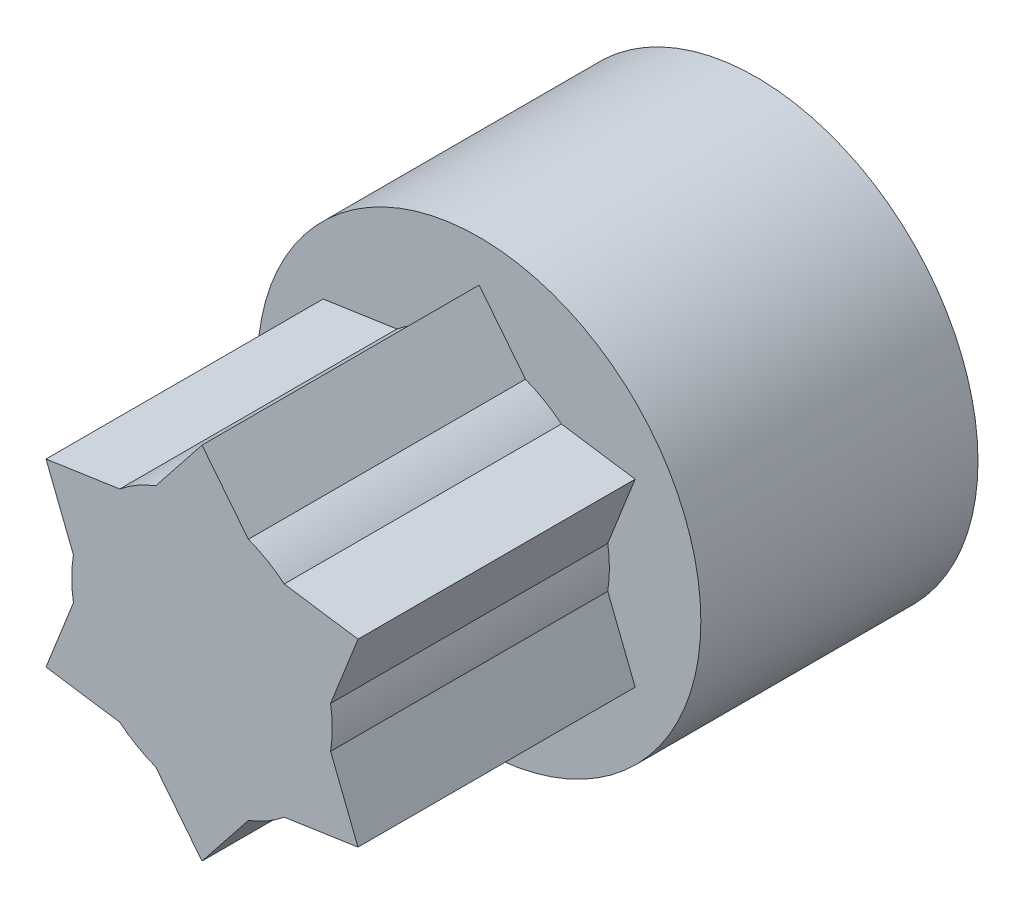
ISO-10303-21;
HEADER;
FILE_DESCRIPTION(('STEP AP214'),'2;1');
FILE_NAME('part.step','',(''),(''),'','','');
FILE_SCHEMA(('AUTOMOTIVE_DESIGN { 1 0 10303 214 1 1 1 1 }'));
ENDSEC;
DATA;
#1=APPLICATION_CONTEXT('core data for automotive mechanical design processes');
#2=APPLICATION_PROTOCOL_DEFINITION('international standard','automotive_design',2000,#1);
#3=PRODUCT_CONTEXT('',#1,'mechanical');
#4=PRODUCT('Part','Part','',(#3));
#5=PRODUCT_RELATED_PRODUCT_CATEGORY('part','',(#4));
#6=PRODUCT_DEFINITION_FORMATION('','',#4);
#7=PRODUCT_DEFINITION_CONTEXT('part definition',#1,'design');
#8=PRODUCT_DEFINITION('design','',#6,#7);
#9=PRODUCT_DEFINITION_SHAPE('','',#8);
#10=(LENGTH_UNIT() NAMED_UNIT(*) SI_UNIT(.MILLI.,.METRE.));
#11=(NAMED_UNIT(*) PLANE_ANGLE_UNIT() SI_UNIT($,.RADIAN.));
#12=(NAMED_UNIT(*) SI_UNIT($,.STERADIAN.) SOLID_ANGLE_UNIT());
#13=UNCERTAINTY_MEASURE_WITH_UNIT(LENGTH_MEASURE(1.E-05),#10,'distance_accuracy_value','');
#14=(GEOMETRIC_REPRESENTATION_CONTEXT(3) GLOBAL_UNCERTAINTY_ASSIGNED_CONTEXT((#13)) GLOBAL_UNIT_ASSIGNED_CONTEXT((#10,
#11,#12)) REPRESENTATION_CONTEXT('',''));
#15=CARTESIAN_POINT('',(0.,0.,0.));
#16=DIRECTION('',(0.,0.,1.));
#17=DIRECTION('',(1.,0.,0.));
#18=AXIS2_PLACEMENT_3D('',#15,#16,#17);
#19=CARTESIAN_POINT('',(0.,0.,36.602998));
#20=DIRECTION('',(0.,0.,-1.));
#21=DIRECTION('',(-1.,0.,0.));
#22=AXIS2_PLACEMENT_3D('',#19,#20,#21);
#23=CYLINDRICAL_SURFACE('',#22,2.35);
#24=CARTESIAN_POINT('',(0.,0.,31.602998));
#25=DIRECTION('',(0.,0.,1.));
#26=DIRECTION('',(1.,0.,0.));
#27=AXIS2_PLACEMENT_3D('',#24,#25,#26);
#28=CIRCLE('',#27,2.35);
#29=CARTESIAN_POINT('',(2.32002328579731,-0.374154985745534,31.602998));
#30=VERTEX_POINT('',#29);
#31=CARTESIAN_POINT('',(2.32002328579732,0.374154985745518,31.602998));
#32=VERTEX_POINT('',#31);
#33=EDGE_CURVE('E162',#30,#32,#28,.T.);
#34=ORIENTED_EDGE('',*,*,#33,.T.);
#35=DIRECTION('',(0.,0.,-1.));
#36=VECTOR('',#35,1.);
#37=CARTESIAN_POINT('',(2.32002328579732,0.374154985745518,36.602998));
#38=LINE('',#37,#36);
#39=CARTESIAN_POINT('',(2.32002328579732,0.374154985745518,36.602998));
#40=VERTEX_POINT('',#39);
#41=EDGE_CURVE('E11',#40,#32,#38,.T.);
#42=ORIENTED_EDGE('',*,*,#41,.F.);
#43=CARTESIAN_POINT('',(0.,0.,36.602998));
#44=DIRECTION('',(0.,0.,1.));
#45=DIRECTION('',(1.,0.,0.));
#46=AXIS2_PLACEMENT_3D('',#43,#44,#45);
#47=CIRCLE('',#46,2.35);
#48=CARTESIAN_POINT('',(2.32002328579731,-0.374154985745534,36.602998));
#49=VERTEX_POINT('',#48);
#50=EDGE_CURVE('E234',#49,#40,#47,.T.);
#51=ORIENTED_EDGE('',*,*,#50,.F.);
#52=DIRECTION('',(0.,0.,-1.));
#53=VECTOR('',#52,1.);
#54=CARTESIAN_POINT('',(2.32002328579731,-0.374154985745534,36.602998));
#55=LINE('',#54,#53);
#56=EDGE_CURVE('E53',#49,#30,#55,.T.);
#57=ORIENTED_EDGE('',*,*,#56,.T.);
#58=EDGE_LOOP('',(#34,#42,#51,#57));
#59=FACE_BOUND('',#58,.T.);
#60=ADVANCED_FACE('F37',(#59),#23,.T.);
#61=CARTESIAN_POINT('',(1.87844159797998,-0.742698501462353,36.602998));
#62=DIRECTION('',(-0.929950766952791,0.367684064169113,0.));
#63=DIRECTION('',(-0.367684064169113,-0.929950766952791,0.));
#64=AXIS2_PLACEMENT_3D('',#61,#62,#63);
#65=PLANE('',#64);
#66=DIRECTION('',(0.367684064169113,0.929950766952791,0.));
#67=VECTOR('',#66,1.);
#68=CARTESIAN_POINT('',(1.87844159797998,-0.742698501462353,31.602998));
#69=LINE('',#68,#67);
#70=CARTESIAN_POINT('',(2.81458256229943,1.62499999999999,31.602998));
#71=VERTEX_POINT('',#70);
#72=EDGE_CURVE('E159',#32,#71,#69,.T.);
#73=ORIENTED_EDGE('',*,*,#72,.T.);
#74=DIRECTION('',(0.,0.,-1.));
#75=VECTOR('',#74,1.);
#76=CARTESIAN_POINT('',(2.81458256229943,1.62499999999999,36.602998));
#77=LINE('',#76,#75);
#78=CARTESIAN_POINT('',(2.81458256229943,1.62499999999999,36.602998));
#79=VERTEX_POINT('',#78);
#80=EDGE_CURVE('E46',#79,#71,#77,.T.);
#81=ORIENTED_EDGE('',*,*,#80,.F.);
#82=DIRECTION('',(0.367684064169113,0.929950766952791,0.));
#83=VECTOR('',#82,1.);
#84=CARTESIAN_POINT('',(1.87844159797998,-0.742698501462353,36.602998));
#85=LINE('',#84,#83);
#86=EDGE_CURVE('E170',#40,#79,#85,.T.);
#87=ORIENTED_EDGE('',*,*,#86,.F.);
#88=ORIENTED_EDGE('',*,*,#41,.T.);
#89=EDGE_LOOP('',(#73,#81,#87,#88));
#90=FACE_BOUND('',#89,.T.);
#91=ADVANCED_FACE('F39',(#90),#65,.F.);
#92=CARTESIAN_POINT('',(0.296025029370969,1.99812739410728,36.602998));
#93=DIRECTION('',(0.14655164333924,0.989203020534495,0.));
#94=DIRECTION('',(-0.989203020534495,0.14655164333924,0.));
#95=AXIS2_PLACEMENT_3D('',#92,#93,#94);
#96=PLANE('',#95);
#97=DIRECTION('',(0.989203020534495,-0.14655164333924,0.));
#98=VECTOR('',#97,1.);
#99=CARTESIAN_POINT('',(0.296025029370969,1.99812739410728,31.602998));
#100=LINE('',#99,#98);
#101=CARTESIAN_POINT('',(1.48403936550689,1.82212160999915,31.602998));
#102=VERTEX_POINT('',#101);
#103=EDGE_CURVE('E164',#102,#71,#100,.T.);
#104=ORIENTED_EDGE('',*,*,#103,.F.);
#105=DIRECTION('',(0.,0.,-1.));
#106=VECTOR('',#105,1.);
#107=CARTESIAN_POINT('',(1.48403936550689,1.82212160999915,36.602998));
#108=LINE('',#107,#106);
#109=CARTESIAN_POINT('',(1.48403936550689,1.82212160999915,36.602998));
#110=VERTEX_POINT('',#109);
#111=EDGE_CURVE('E271',#110,#102,#108,.T.);
#112=ORIENTED_EDGE('',*,*,#111,.F.);
#113=DIRECTION('',(0.989203020534495,-0.14655164333924,0.));
#114=VECTOR('',#113,1.);
#115=CARTESIAN_POINT('',(0.296025029370969,1.99812739410728,36.602998));
#116=LINE('',#115,#114);
#117=EDGE_CURVE('E276',#110,#79,#116,.T.);
#118=ORIENTED_EDGE('',*,*,#117,.T.);
#119=ORIENTED_EDGE('',*,*,#80,.T.);
#120=EDGE_LOOP('',(#104,#112,#118,#119));
#121=FACE_BOUND('',#120,.T.);
#122=ADVANCED_FACE('F274',(#121),#96,.T.);
#123=CARTESIAN_POINT('',(0.83598392029043,2.19627659574468,31.602998));
#124=VERTEX_POINT('',#123);
#125=EDGE_CURVE('E176',#102,#124,#28,.T.);
#126=ORIENTED_EDGE('',*,*,#125,.T.);
#127=DIRECTION('',(0.,0.,-1.));
#128=VECTOR('',#127,1.);
#129=CARTESIAN_POINT('',(0.83598392029043,2.19627659574468,36.602998));
#130=LINE('',#129,#128);
#131=CARTESIAN_POINT('',(0.83598392029043,2.19627659574468,36.602998));
#132=VERTEX_POINT('',#131);
#133=EDGE_CURVE('E269',#132,#124,#130,.T.);
#134=ORIENTED_EDGE('',*,*,#133,.F.);
#135=EDGE_CURVE('E279',#110,#132,#47,.T.);
#136=ORIENTED_EDGE('',*,*,#135,.F.);
#137=ORIENTED_EDGE('',*,*,#111,.T.);
#138=EDGE_LOOP('',(#126,#134,#136,#137));
#139=FACE_BOUND('',#138,.T.);
#140=ADVANCED_FACE('F357',(#139),#23,.T.);
#141=CARTESIAN_POINT('',(1.58241656860902,1.25542889264493,36.602998));
#142=DIRECTION('',(-0.783399123613554,-0.621518956365384,0.));
#143=DIRECTION('',(0.621518956365384,-0.783399123613553,0.));
#144=AXIS2_PLACEMENT_3D('',#141,#142,#143);
#145=PLANE('',#144);
#146=DIRECTION('',(-0.621518956365384,0.783399123613554,0.));
#147=VECTOR('',#146,1.);
#148=CARTESIAN_POINT('',(1.58241656860902,1.25542889264493,31.602998));
#149=LINE('',#148,#147);
#150=CARTESIAN_POINT('',(0.,3.25,31.602998));
#151=VERTEX_POINT('',#150);
#152=EDGE_CURVE('E186',#124,#151,#149,.T.);
#153=ORIENTED_EDGE('',*,*,#152,.T.);
#154=DIRECTION('',(0.,0.,-1.));
#155=VECTOR('',#154,1.);
#156=CARTESIAN_POINT('',(0.,3.25,36.602998));
#157=LINE('',#156,#155);
#158=CARTESIAN_POINT('',(0.,3.25,36.602998));
#159=VERTEX_POINT('',#158);
#160=EDGE_CURVE('E266',#159,#151,#157,.T.);
#161=ORIENTED_EDGE('',*,*,#160,.F.);
#162=DIRECTION('',(-0.621518956365384,0.783399123613554,0.));
#163=VECTOR('',#162,1.);
#164=CARTESIAN_POINT('',(1.58241656860902,1.25542889264493,36.602998));
#165=LINE('',#164,#163);
#166=EDGE_CURVE('E281',#132,#159,#165,.T.);
#167=ORIENTED_EDGE('',*,*,#166,.F.);
#168=ORIENTED_EDGE('',*,*,#133,.T.);
#169=EDGE_LOOP('',(#153,#161,#167,#168));
#170=FACE_BOUND('',#169,.T.);
#171=ADVANCED_FACE('F356',(#170),#145,.F.);
#172=CARTESIAN_POINT('',(-1.58241656860902,1.25542889264493,36.602998));
#173=DIRECTION('',(-0.783399123613554,0.621518956365384,0.));
#174=DIRECTION('',(-0.621518956365384,-0.783399123613553,0.));
#175=AXIS2_PLACEMENT_3D('',#172,#173,#174);
#176=PLANE('',#175);
#177=DIRECTION('',(0.621518956365384,0.783399123613554,0.));
#178=VECTOR('',#177,1.);
#179=CARTESIAN_POINT('',(-1.58241656860902,1.25542889264493,31.602998));
#180=LINE('',#179,#178);
#181=CARTESIAN_POINT('',(-0.83598392029043,2.19627659574468,31.602998));
#182=VERTEX_POINT('',#181);
#183=EDGE_CURVE('E193',#182,#151,#180,.T.);
#184=ORIENTED_EDGE('',*,*,#183,.F.);
#185=DIRECTION('',(0.,0.,-1.));
#186=VECTOR('',#185,1.);
#187=CARTESIAN_POINT('',(-0.83598392029043,2.19627659574468,36.602998));
#188=LINE('',#187,#186);
#189=CARTESIAN_POINT('',(-0.83598392029043,2.19627659574468,36.602998));
#190=VERTEX_POINT('',#189);
#191=EDGE_CURVE('E264',#190,#182,#188,.T.);
#192=ORIENTED_EDGE('',*,*,#191,.F.);
#193=DIRECTION('',(0.621518956365384,0.783399123613554,0.));
#194=VECTOR('',#193,1.);
#195=CARTESIAN_POINT('',(-1.58241656860902,1.25542889264493,36.602998));
#196=LINE('',#195,#194);
#197=EDGE_CURVE('E287',#190,#159,#196,.T.);
#198=ORIENTED_EDGE('',*,*,#197,.T.);
#199=ORIENTED_EDGE('',*,*,#160,.T.);
#200=EDGE_LOOP('',(#184,#192,#198,#199));
#201=FACE_BOUND('',#200,.T.);
#202=ADVANCED_FACE('F352',(#201),#176,.T.);
#203=CARTESIAN_POINT('',(-1.48403936550686,1.82212160999918,31.602998));
#204=VERTEX_POINT('',#203);
#205=EDGE_CURVE('E187',#182,#204,#28,.T.);
#206=ORIENTED_EDGE('',*,*,#205,.T.);
#207=DIRECTION('',(0.,0.,-1.));
#208=VECTOR('',#207,1.);
#209=CARTESIAN_POINT('',(-1.48403936550686,1.82212160999918,36.602998));
#210=LINE('',#209,#208);
#211=CARTESIAN_POINT('',(-1.48403936550686,1.82212160999918,36.602998));
#212=VERTEX_POINT('',#211);
#213=EDGE_CURVE('E262',#212,#204,#210,.T.);
#214=ORIENTED_EDGE('',*,*,#213,.F.);
#215=EDGE_CURVE('E283',#190,#212,#47,.T.);
#216=ORIENTED_EDGE('',*,*,#215,.F.);
#217=ORIENTED_EDGE('',*,*,#191,.T.);
#218=EDGE_LOOP('',(#206,#214,#216,#217));
#219=FACE_BOUND('',#218,.T.);
#220=ADVANCED_FACE('F349',(#219),#23,.T.);
#221=CARTESIAN_POINT('',(-0.296025029370941,1.99812739410728,36.602998));
#222=DIRECTION('',(0.146551643339226,-0.989203020534497,0.));
#223=DIRECTION('',(0.989203020534497,0.146551643339226,0.));
#224=AXIS2_PLACEMENT_3D('',#221,#222,#223);
#225=PLANE('',#224);
#226=DIRECTION('',(-0.989203020534497,-0.146551643339226,0.));
#227=VECTOR('',#226,1.);
#228=CARTESIAN_POINT('',(-0.296025029370941,1.99812739410728,31.602998));
#229=LINE('',#228,#227);
#230=CARTESIAN_POINT('',(-2.81458256229941,1.62500000000003,31.602998));
#231=VERTEX_POINT('',#230);
#232=EDGE_CURVE('E197',#204,#231,#229,.T.);
#233=ORIENTED_EDGE('',*,*,#232,.T.);
#234=DIRECTION('',(0.,0.,-1.));
#235=VECTOR('',#234,1.);
#236=CARTESIAN_POINT('',(-2.81458256229941,1.62500000000003,36.602998));
#237=LINE('',#236,#235);
#238=CARTESIAN_POINT('',(-2.81458256229941,1.62500000000003,36.602998));
#239=VERTEX_POINT('',#238);
#240=EDGE_CURVE('E259',#239,#231,#237,.T.);
#241=ORIENTED_EDGE('',*,*,#240,.F.);
#242=DIRECTION('',(-0.989203020534497,-0.146551643339226,0.));
#243=VECTOR('',#242,1.);
#244=CARTESIAN_POINT('',(-0.296025029370941,1.99812739410728,36.602998));
#245=LINE('',#244,#243);
#246=EDGE_CURVE('E290',#212,#239,#245,.T.);
#247=ORIENTED_EDGE('',*,*,#246,.F.);
#248=ORIENTED_EDGE('',*,*,#213,.T.);
#249=EDGE_LOOP('',(#233,#241,#247,#248));
#250=FACE_BOUND('',#249,.T.);
#251=ADVANCED_FACE('F346',(#250),#225,.F.);
#252=CARTESIAN_POINT('',(-1.87844159797999,-0.742698501462326,36.602998));
#253=DIRECTION('',(-0.929950766952796,-0.3676840641691,0.));
#254=DIRECTION('',(0.3676840641691,-0.929950766952796,0.));
#255=AXIS2_PLACEMENT_3D('',#252,#253,#254);
#256=PLANE('',#255);
#257=DIRECTION('',(-0.3676840641691,0.929950766952796,0.));
#258=VECTOR('',#257,1.);
#259=CARTESIAN_POINT('',(-1.87844159797999,-0.742698501462326,31.602998));
#260=LINE('',#259,#258);
#261=CARTESIAN_POINT('',(-2.32002328579731,0.37415498574555,31.602998));
#262=VERTEX_POINT('',#261);
#263=EDGE_CURVE('E204',#262,#231,#260,.T.);
#264=ORIENTED_EDGE('',*,*,#263,.F.);
#265=DIRECTION('',(0.,0.,-1.));
#266=VECTOR('',#265,1.);
#267=CARTESIAN_POINT('',(-2.32002328579731,0.37415498574555,36.602998));
#268=LINE('',#267,#266);
#269=CARTESIAN_POINT('',(-2.32002328579731,0.37415498574555,36.602998));
#270=VERTEX_POINT('',#269);
#271=EDGE_CURVE('E257',#270,#262,#268,.T.);
#272=ORIENTED_EDGE('',*,*,#271,.F.);
#273=DIRECTION('',(-0.3676840641691,0.929950766952796,0.));
#274=VECTOR('',#273,1.);
#275=CARTESIAN_POINT('',(-1.87844159797999,-0.742698501462326,36.602998));
#276=LINE('',#275,#274);
#277=EDGE_CURVE('E292',#270,#239,#276,.T.);
#278=ORIENTED_EDGE('',*,*,#277,.T.);
#279=ORIENTED_EDGE('',*,*,#240,.T.);
#280=EDGE_LOOP('',(#264,#272,#278,#279));
#281=FACE_BOUND('',#280,.T.);
#282=ADVANCED_FACE('F342',(#281),#256,.T.);
#283=CARTESIAN_POINT('',(-2.32002328579732,-0.374154985745501,31.602998));
#284=VERTEX_POINT('',#283);
#285=EDGE_CURVE('E198',#262,#284,#28,.T.);
#286=ORIENTED_EDGE('',*,*,#285,.T.);
#287=DIRECTION('',(0.,0.,-1.));
#288=VECTOR('',#287,1.);
#289=CARTESIAN_POINT('',(-2.32002328579732,-0.374154985745501,36.602998));
#290=LINE('',#289,#288);
#291=CARTESIAN_POINT('',(-2.32002328579732,-0.374154985745501,36.602998));
#292=VERTEX_POINT('',#291);
#293=EDGE_CURVE('E255',#292,#284,#290,.T.);
#294=ORIENTED_EDGE('',*,*,#293,.F.);
#295=EDGE_CURVE('E295',#270,#292,#47,.T.);
#296=ORIENTED_EDGE('',*,*,#295,.F.);
#297=ORIENTED_EDGE('',*,*,#271,.T.);
#298=EDGE_LOOP('',(#286,#294,#296,#297));
#299=FACE_BOUND('',#298,.T.);
#300=ADVANCED_FACE('F339',(#299),#23,.T.);
#301=CARTESIAN_POINT('',(-1.87844159797998,0.742698501462366,36.602998));
#302=DIRECTION('',(0.929950766952788,-0.36768406416912,0.));
#303=DIRECTION('',(0.36768406416912,0.929950766952788,0.));
#304=AXIS2_PLACEMENT_3D('',#301,#302,#303);
#305=PLANE('',#304);
#306=DIRECTION('',(-0.36768406416912,-0.929950766952788,0.));
#307=VECTOR('',#306,1.);
#308=CARTESIAN_POINT('',(-1.87844159797998,0.742698501462366,31.602998));
#309=LINE('',#308,#307);
#310=CARTESIAN_POINT('',(-2.81458256229944,-1.62499999999997,31.602998));
#311=VERTEX_POINT('',#310);
#312=EDGE_CURVE('E208',#284,#311,#309,.T.);
#313=ORIENTED_EDGE('',*,*,#312,.T.);
#314=DIRECTION('',(0.,0.,-1.));
#315=VECTOR('',#314,1.);
#316=CARTESIAN_POINT('',(-2.81458256229944,-1.62499999999997,36.602998));
#317=LINE('',#316,#315);
#318=CARTESIAN_POINT('',(-2.81458256229944,-1.62499999999997,36.602998));
#319=VERTEX_POINT('',#318);
#320=EDGE_CURVE('E253',#319,#311,#317,.T.);
#321=ORIENTED_EDGE('',*,*,#320,.F.);
#322=DIRECTION('',(-0.36768406416912,-0.929950766952788,0.));
#323=VECTOR('',#322,1.);
#324=CARTESIAN_POINT('',(-1.87844159797998,0.742698501462366,36.602998));
#325=LINE('',#324,#323);
#326=EDGE_CURVE('E296',#292,#319,#325,.T.);
#327=ORIENTED_EDGE('',*,*,#326,.F.);
#328=ORIENTED_EDGE('',*,*,#293,.T.);
#329=EDGE_LOOP('',(#313,#321,#327,#328));
#330=FACE_BOUND('',#329,.T.);
#331=ADVANCED_FACE('F336',(#330),#305,.F.);
#332=CARTESIAN_POINT('',(-0.296025029370983,-1.99812739410727,36.602998));
#333=DIRECTION('',(-0.146551643339247,-0.989203020534494,0.));
#334=DIRECTION('',(0.989203020534494,-0.146551643339247,0.));
#335=AXIS2_PLACEMENT_3D('',#332,#333,#334);
#336=PLANE('',#335);
#337=DIRECTION('',(-0.989203020534494,0.146551643339247,0.));
#338=VECTOR('',#337,1.);
#339=CARTESIAN_POINT('',(-0.296025029370983,-1.99812739410727,31.602998));
#340=LINE('',#339,#338);
#341=CARTESIAN_POINT('',(-1.4840393655069,-1.82212160999914,31.602998));
#342=VERTEX_POINT('',#341);
#343=EDGE_CURVE('E214',#342,#311,#340,.T.);
#344=ORIENTED_EDGE('',*,*,#343,.F.);
#345=DIRECTION('',(0.,0.,-1.));
#346=VECTOR('',#345,1.);
#347=CARTESIAN_POINT('',(-1.4840393655069,-1.82212160999914,36.602998));
#348=LINE('',#347,#346);
#349=CARTESIAN_POINT('',(-1.4840393655069,-1.82212160999914,36.602998));
#350=VERTEX_POINT('',#349);
#351=EDGE_CURVE('E251',#350,#342,#348,.T.);
#352=ORIENTED_EDGE('',*,*,#351,.F.);
#353=DIRECTION('',(-0.989203020534494,0.146551643339247,0.));
#354=VECTOR('',#353,1.);
#355=CARTESIAN_POINT('',(-0.296025029370983,-1.99812739410727,36.602998));
#356=LINE('',#355,#354);
#357=EDGE_CURVE('E298',#350,#319,#356,.T.);
#358=ORIENTED_EDGE('',*,*,#357,.T.);
#359=ORIENTED_EDGE('',*,*,#320,.T.);
#360=EDGE_LOOP('',(#344,#352,#358,#359));
#361=FACE_BOUND('',#360,.T.);
#362=ADVANCED_FACE('F334',(#361),#336,.T.);
#363=CARTESIAN_POINT('',(-0.835983920290445,-2.19627659574468,31.602998));
#364=VERTEX_POINT('',#363);
#365=EDGE_CURVE('E184',#342,#364,#28,.T.);
#366=ORIENTED_EDGE('',*,*,#365,.T.);
#367=DIRECTION('',(0.,0.,-1.));
#368=VECTOR('',#367,1.);
#369=CARTESIAN_POINT('',(-0.835983920290445,-2.19627659574468,36.602998));
#370=LINE('',#369,#368);
#371=CARTESIAN_POINT('',(-0.835983920290445,-2.19627659574468,36.602998));
#372=VERTEX_POINT('',#371);
#373=EDGE_CURVE('E249',#372,#364,#370,.T.);
#374=ORIENTED_EDGE('',*,*,#373,.F.);
#375=EDGE_CURVE('E301',#350,#372,#47,.T.);
#376=ORIENTED_EDGE('',*,*,#375,.F.);
#377=ORIENTED_EDGE('',*,*,#351,.T.);
#378=EDGE_LOOP('',(#366,#374,#376,#377));
#379=FACE_BOUND('',#378,.T.);
#380=ADVANCED_FACE('F329',(#379),#23,.T.);
#381=CARTESIAN_POINT('',(-1.58241656860903,-1.25542889264492,36.602998));
#382=DIRECTION('',(0.783399123613558,0.621518956365379,0.));
#383=DIRECTION('',(-0.621518956365379,0.783399123613558,0.));
#384=AXIS2_PLACEMENT_3D('',#381,#382,#383);
#385=PLANE('',#384);
#386=DIRECTION('',(0.621518956365379,-0.783399123613558,0.));
#387=VECTOR('',#386,1.);
#388=CARTESIAN_POINT('',(-1.58241656860903,-1.25542889264492,31.602998));
#389=LINE('',#388,#387);
#390=CARTESIAN_POINT('',(0.,-3.25,31.602998));
#391=VERTEX_POINT('',#390);
#392=EDGE_CURVE('E218',#364,#391,#389,.T.);
#393=ORIENTED_EDGE('',*,*,#392,.T.);
#394=DIRECTION('',(0.,0.,-1.));
#395=VECTOR('',#394,1.);
#396=CARTESIAN_POINT('',(0.,-3.25,36.602998));
#397=LINE('',#396,#395);
#398=CARTESIAN_POINT('',(0.,-3.25,36.602998));
#399=VERTEX_POINT('',#398);
#400=EDGE_CURVE('E246',#399,#391,#397,.T.);
#401=ORIENTED_EDGE('',*,*,#400,.F.);
#402=DIRECTION('',(0.621518956365379,-0.783399123613558,0.));
#403=VECTOR('',#402,1.);
#404=CARTESIAN_POINT('',(-1.58241656860903,-1.25542889264492,36.602998));
#405=LINE('',#404,#403);
#406=EDGE_CURVE('E302',#372,#399,#405,.T.);
#407=ORIENTED_EDGE('',*,*,#406,.F.);
#408=ORIENTED_EDGE('',*,*,#373,.T.);
#409=EDGE_LOOP('',(#393,#401,#407,#408));
#410=FACE_BOUND('',#409,.T.);
#411=ADVANCED_FACE('F326',(#410),#385,.F.);
#412=CARTESIAN_POINT('',(1.58241656860901,-1.25542889264494,36.602998));
#413=DIRECTION('',(0.783399123613549,-0.62151895636539,0.));
#414=DIRECTION('',(0.62151895636539,0.783399123613549,0.));
#415=AXIS2_PLACEMENT_3D('',#412,#413,#414);
#416=PLANE('',#415);
#417=DIRECTION('',(-0.62151895636539,-0.783399123613549,0.));
#418=VECTOR('',#417,1.);
#419=CARTESIAN_POINT('',(1.58241656860901,-1.25542889264494,31.602998));
#420=LINE('',#419,#418);
#421=CARTESIAN_POINT('',(0.835983920290415,-2.19627659574469,31.602998));
#422=VERTEX_POINT('',#421);
#423=EDGE_CURVE('E183',#422,#391,#420,.T.);
#424=ORIENTED_EDGE('',*,*,#423,.F.);
#425=DIRECTION('',(0.,0.,-1.));
#426=VECTOR('',#425,1.);
#427=CARTESIAN_POINT('',(0.835983920290415,-2.19627659574469,36.602998));
#428=LINE('',#427,#426);
#429=CARTESIAN_POINT('',(0.835983920290415,-2.19627659574469,36.602998));
#430=VERTEX_POINT('',#429);
#431=EDGE_CURVE('E243',#430,#422,#428,.T.);
#432=ORIENTED_EDGE('',*,*,#431,.F.);
#433=DIRECTION('',(-0.62151895636539,-0.783399123613549,0.));
#434=VECTOR('',#433,1.);
#435=CARTESIAN_POINT('',(1.58241656860901,-1.25542889264494,36.602998));
#436=LINE('',#435,#434);
#437=EDGE_CURVE('E304',#430,#399,#436,.T.);
#438=ORIENTED_EDGE('',*,*,#437,.T.);
#439=ORIENTED_EDGE('',*,*,#400,.T.);
#440=EDGE_LOOP('',(#424,#432,#438,#439));
#441=FACE_BOUND('',#440,.T.);
#442=ADVANCED_FACE('F323',(#441),#416,.T.);
#443=CARTESIAN_POINT('',(1.48403936550688,-1.82212160999917,31.602998));
#444=VERTEX_POINT('',#443);
#445=EDGE_CURVE('E175',#422,#444,#28,.T.);
#446=ORIENTED_EDGE('',*,*,#445,.T.);
#447=DIRECTION('',(0.,0.,-1.));
#448=VECTOR('',#447,1.);
#449=CARTESIAN_POINT('',(1.48403936550688,-1.82212160999917,36.602998));
#450=LINE('',#449,#448);
#451=CARTESIAN_POINT('',(1.48403936550688,-1.82212160999917,36.602998));
#452=VERTEX_POINT('',#451);
#453=EDGE_CURVE('E240',#452,#444,#450,.T.);
#454=ORIENTED_EDGE('',*,*,#453,.F.);
#455=EDGE_CURVE('E307',#430,#452,#47,.T.);
#456=ORIENTED_EDGE('',*,*,#455,.F.);
#457=ORIENTED_EDGE('',*,*,#431,.T.);
#458=EDGE_LOOP('',(#446,#454,#456,#457));
#459=FACE_BOUND('',#458,.T.);
#460=ADVANCED_FACE('F320',(#459),#23,.T.);
#461=CARTESIAN_POINT('',(0.296025029370955,-1.99812739410728,36.602998));
#462=DIRECTION('',(-0.146551643339233,0.989203020534496,0.));
#463=DIRECTION('',(-0.989203020534496,-0.146551643339233,0.));
#464=AXIS2_PLACEMENT_3D('',#461,#462,#463);
#465=PLANE('',#464);
#466=DIRECTION('',(0.989203020534496,0.146551643339233,0.));
#467=VECTOR('',#466,1.);
#468=CARTESIAN_POINT('',(0.296025029370955,-1.99812739410728,31.602998));
#469=LINE('',#468,#467);
#470=CARTESIAN_POINT('',(2.81458256229942,-1.62500000000001,31.602998));
#471=VERTEX_POINT('',#470);
#472=EDGE_CURVE('E182',#444,#471,#469,.T.);
#473=ORIENTED_EDGE('',*,*,#472,.T.);
#474=DIRECTION('',(0.,0.,-1.));
#475=VECTOR('',#474,1.);
#476=CARTESIAN_POINT('',(2.81458256229942,-1.62500000000001,36.602998));
#477=LINE('',#476,#475);
#478=CARTESIAN_POINT('',(2.81458256229942,-1.62500000000001,36.602998));
#479=VERTEX_POINT('',#478);
#480=EDGE_CURVE('E236',#479,#471,#477,.T.);
#481=ORIENTED_EDGE('',*,*,#480,.F.);
#482=DIRECTION('',(0.989203020534496,0.146551643339233,0.));
#483=VECTOR('',#482,1.);
#484=CARTESIAN_POINT('',(0.296025029370955,-1.99812739410728,36.602998));
#485=LINE('',#484,#483);
#486=EDGE_CURVE('E308',#452,#479,#485,.T.);
#487=ORIENTED_EDGE('',*,*,#486,.F.);
#488=ORIENTED_EDGE('',*,*,#453,.T.);
#489=EDGE_LOOP('',(#473,#481,#487,#488));
#490=FACE_BOUND('',#489,.T.);
#491=ADVANCED_FACE('F318',(#490),#465,.F.);
#492=CARTESIAN_POINT('',(1.87844159797999,0.74269850146234,36.602998));
#493=DIRECTION('',(0.929950766952793,0.367684064169107,0.));
#494=DIRECTION('',(-0.367684064169107,0.929950766952793,0.));
#495=AXIS2_PLACEMENT_3D('',#492,#493,#494);
#496=PLANE('',#495);
#497=DIRECTION('',(0.367684064169107,-0.929950766952793,0.));
#498=VECTOR('',#497,1.);
#499=CARTESIAN_POINT('',(1.87844159797999,0.74269850146234,31.602998));
#500=LINE('',#499,#498);
#501=EDGE_CURVE('E232',#30,#471,#500,.T.);
#502=ORIENTED_EDGE('',*,*,#501,.F.);
#503=ORIENTED_EDGE('',*,*,#56,.F.);
#504=DIRECTION('',(0.367684064169107,-0.929950766952793,0.));
#505=VECTOR('',#504,1.);
#506=CARTESIAN_POINT('',(1.87844159797999,0.74269850146234,36.602998));
#507=LINE('',#506,#505);
#508=EDGE_CURVE('E237',#49,#479,#507,.T.);
#509=ORIENTED_EDGE('',*,*,#508,.T.);
#510=ORIENTED_EDGE('',*,*,#480,.T.);
#511=EDGE_LOOP('',(#502,#503,#509,#510));
#512=FACE_BOUND('',#511,.T.);
#513=ADVANCED_FACE('F310',(#512),#496,.T.);
#514=CARTESIAN_POINT('',(0.,0.,36.602998));
#515=DIRECTION('',(0.,0.,1.));
#516=DIRECTION('',(1.,0.,0.));
#517=AXIS2_PLACEMENT_3D('',#514,#515,#516);
#518=PLANE('',#517);
#519=ORIENTED_EDGE('',*,*,#50,.T.);
#520=ORIENTED_EDGE('',*,*,#86,.T.);
#521=ORIENTED_EDGE('',*,*,#117,.F.);
#522=ORIENTED_EDGE('',*,*,#135,.T.);
#523=ORIENTED_EDGE('',*,*,#166,.T.);
#524=ORIENTED_EDGE('',*,*,#197,.F.);
#525=ORIENTED_EDGE('',*,*,#215,.T.);
#526=ORIENTED_EDGE('',*,*,#246,.T.);
#527=ORIENTED_EDGE('',*,*,#277,.F.);
#528=ORIENTED_EDGE('',*,*,#295,.T.);
#529=ORIENTED_EDGE('',*,*,#326,.T.);
#530=ORIENTED_EDGE('',*,*,#357,.F.);
#531=ORIENTED_EDGE('',*,*,#375,.T.);
#532=ORIENTED_EDGE('',*,*,#406,.T.);
#533=ORIENTED_EDGE('',*,*,#437,.F.);
#534=ORIENTED_EDGE('',*,*,#455,.T.);
#535=ORIENTED_EDGE('',*,*,#486,.T.);
#536=ORIENTED_EDGE('',*,*,#508,.F.);
#537=EDGE_LOOP('',(#519,#520,#521,#522,#523,#524,#525,#526,#527,#528,#529,#530,#531,#532,#533,
#534,#535,#536));
#538=FACE_BOUND('',#537,.T.);
#539=ADVANCED_FACE('F312',(#538),#518,.T.);
#540=CARTESIAN_POINT('',(0.,0.,31.602998));
#541=DIRECTION('',(0.,0.,1.));
#542=DIRECTION('',(1.,0.,0.));
#543=AXIS2_PLACEMENT_3D('',#540,#541,#542);
#544=PLANE('',#543);
#545=CARTESIAN_POINT('',(0.,0.,31.602998));
#546=DIRECTION('',(0.,0.,1.));
#547=DIRECTION('',(1.,0.,0.));
#548=AXIS2_PLACEMENT_3D('',#545,#546,#547);
#549=CIRCLE('',#548,4.);
#550=CARTESIAN_POINT('',(4.,0.,31.602998));
#551=VERTEX_POINT('',#550);
#552=EDGE_CURVE('E178',#551,#551,#549,.T.);
#553=ORIENTED_EDGE('',*,*,#552,.T.);
#554=EDGE_LOOP('',(#553));
#555=FACE_BOUND('',#554,.T.);
#556=ORIENTED_EDGE('',*,*,#33,.F.);
#557=ORIENTED_EDGE('',*,*,#501,.T.);
#558=ORIENTED_EDGE('',*,*,#472,.F.);
#559=ORIENTED_EDGE('',*,*,#445,.F.);
#560=ORIENTED_EDGE('',*,*,#423,.T.);
#561=ORIENTED_EDGE('',*,*,#392,.F.);
#562=ORIENTED_EDGE('',*,*,#365,.F.);
#563=ORIENTED_EDGE('',*,*,#343,.T.);
#564=ORIENTED_EDGE('',*,*,#312,.F.);
#565=ORIENTED_EDGE('',*,*,#285,.F.);
#566=ORIENTED_EDGE('',*,*,#263,.T.);
#567=ORIENTED_EDGE('',*,*,#232,.F.);
#568=ORIENTED_EDGE('',*,*,#205,.F.);
#569=ORIENTED_EDGE('',*,*,#183,.T.);
#570=ORIENTED_EDGE('',*,*,#152,.F.);
#571=ORIENTED_EDGE('',*,*,#125,.F.);
#572=ORIENTED_EDGE('',*,*,#103,.T.);
#573=ORIENTED_EDGE('',*,*,#72,.F.);
#574=EDGE_LOOP('',(#556,#557,#558,#559,#560,#561,#562,#563,#564,#565,#566,#567,#568,#569,#570,
#571,#572,#573));
#575=FACE_BOUND('',#574,.T.);
#576=ADVANCED_FACE('F160',(#555,#575),#544,.T.);
#577=CARTESIAN_POINT('',(0.,0.,26.602998));
#578=DIRECTION('',(0.,0.,1.));
#579=DIRECTION('',(1.,0.,0.));
#580=AXIS2_PLACEMENT_3D('',#577,#578,#579);
#581=CYLINDRICAL_SURFACE('',#580,4.);
#582=CARTESIAN_POINT('',(0.,0.,26.602998));
#583=DIRECTION('',(0.,0.,1.));
#584=DIRECTION('',(1.,0.,0.));
#585=AXIS2_PLACEMENT_3D('',#582,#583,#584);
#586=CIRCLE('',#585,4.);
#587=CARTESIAN_POINT('',(4.,0.,26.602998));
#588=VERTEX_POINT('',#587);
#589=EDGE_CURVE('E173',#588,#588,#586,.T.);
#590=ORIENTED_EDGE('',*,*,#589,.T.);
#591=EDGE_LOOP('',(#590));
#592=FACE_BOUND('',#591,.T.);
#593=ORIENTED_EDGE('',*,*,#552,.F.);
#594=EDGE_LOOP('',(#593));
#595=FACE_BOUND('',#594,.T.);
#596=ADVANCED_FACE('F363',(#592,#595),#581,.T.);
#597=CARTESIAN_POINT('',(0.,0.,26.602998));
#598=DIRECTION('',(0.,0.,1.));
#599=DIRECTION('',(1.,0.,0.));
#600=AXIS2_PLACEMENT_3D('',#597,#598,#599);
#601=PLANE('',#600);
#602=ORIENTED_EDGE('',*,*,#589,.F.);
#603=EDGE_LOOP('',(#602));
#604=FACE_BOUND('',#603,.T.);
#605=ADVANCED_FACE('F365',(#604),#601,.F.);
#606=CLOSED_SHELL('',(#60,#91,#122,#140,#171,#202,#220,#251,#282,#300,#331,#362,#380,#411,#442,
#460,#491,#513,#539,#576,#596,#605));
#607=MANIFOLD_SOLID_BREP('B2',#606);
#608=ADVANCED_BREP_SHAPE_REPRESENTATION('',(#18,#607),#14);
#609=SHAPE_DEFINITION_REPRESENTATION(#9,#608);
ENDSEC;
END-ISO-10303-21;
